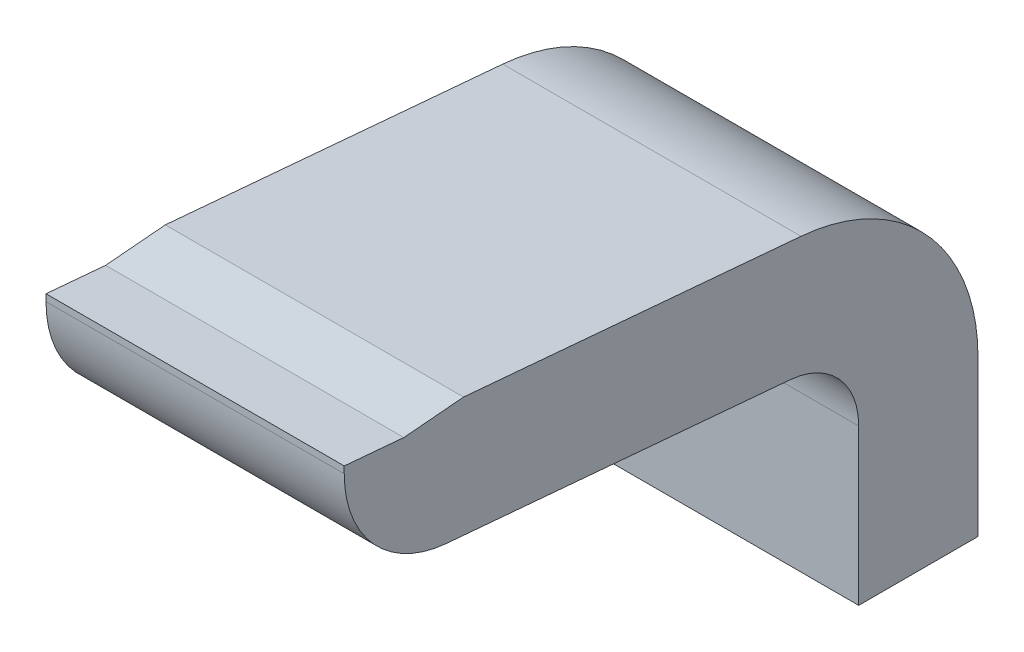
ISO-10303-21;
HEADER;
FILE_DESCRIPTION(('STEP AP214'),'2;1');
FILE_NAME('part.step','',(''),(''),'','','');
FILE_SCHEMA(('AUTOMOTIVE_DESIGN { 1 0 10303 214 1 1 1 1 }'));
ENDSEC;
DATA;
#1=APPLICATION_CONTEXT('core data for automotive mechanical design processes');
#2=APPLICATION_PROTOCOL_DEFINITION('international standard','automotive_design',2000,#1);
#3=PRODUCT_CONTEXT('',#1,'mechanical');
#4=PRODUCT('Part','Part','',(#3));
#5=PRODUCT_RELATED_PRODUCT_CATEGORY('part','',(#4));
#6=PRODUCT_DEFINITION_FORMATION('','',#4);
#7=PRODUCT_DEFINITION_CONTEXT('part definition',#1,'design');
#8=PRODUCT_DEFINITION('design','',#6,#7);
#9=PRODUCT_DEFINITION_SHAPE('','',#8);
#10=(LENGTH_UNIT() NAMED_UNIT(*) SI_UNIT(.MILLI.,.METRE.));
#11=(NAMED_UNIT(*) PLANE_ANGLE_UNIT() SI_UNIT($,.RADIAN.));
#12=(NAMED_UNIT(*) SI_UNIT($,.STERADIAN.) SOLID_ANGLE_UNIT());
#13=UNCERTAINTY_MEASURE_WITH_UNIT(LENGTH_MEASURE(1.E-05),#10,'distance_accuracy_value','');
#14=(GEOMETRIC_REPRESENTATION_CONTEXT(3) GLOBAL_UNCERTAINTY_ASSIGNED_CONTEXT((#13)) GLOBAL_UNIT_ASSIGNED_CONTEXT((#10,
#11,#12)) REPRESENTATION_CONTEXT('',''));
#15=CARTESIAN_POINT('',(0.,0.,0.));
#16=DIRECTION('',(0.,0.,1.));
#17=DIRECTION('',(1.,0.,0.));
#18=AXIS2_PLACEMENT_3D('',#15,#16,#17);
#19=CARTESIAN_POINT('',(-1.15,-1.25,0.16));
#20=DIRECTION('',(0.,-1.,0.));
#21=DIRECTION('',(0.,0.,-1.));
#22=AXIS2_PLACEMENT_3D('',#19,#20,#21);
#23=PLANE('',#22);
#24=DIRECTION('',(0.,0.,1.));
#25=VECTOR('',#24,1.);
#26=CARTESIAN_POINT('',(-1.15,-1.25,0.26));
#27=LINE('',#26,#25);
#28=CARTESIAN_POINT('',(-1.15,-1.25,0.));
#29=VERTEX_POINT('',#28);
#30=CARTESIAN_POINT('',(-1.15,-1.25,0.16));
#31=VERTEX_POINT('',#30);
#32=EDGE_CURVE('E118',#29,#31,#27,.T.);
#33=ORIENTED_EDGE('',*,*,#32,.F.);
#34=DIRECTION('',(1.,0.,0.));
#35=VECTOR('',#34,1.);
#36=CARTESIAN_POINT('',(-1.15,-1.25,0.));
#37=LINE('',#36,#35);
#38=CARTESIAN_POINT('',(-0.75,-1.25,0.));
#39=VERTEX_POINT('',#38);
#40=EDGE_CURVE('E181',#39,#29,#37,.F.);
#41=ORIENTED_EDGE('',*,*,#40,.F.);
#42=DIRECTION('',(0.,0.,1.));
#43=VECTOR('',#42,1.);
#44=CARTESIAN_POINT('',(-0.75,-1.25,0.26));
#45=LINE('',#44,#43);
#46=CARTESIAN_POINT('',(-0.75,-1.25,0.16));
#47=VERTEX_POINT('',#46);
#48=EDGE_CURVE('E137',#39,#47,#45,.T.);
#49=ORIENTED_EDGE('',*,*,#48,.T.);
#50=DIRECTION('',(1.,0.,0.));
#51=VECTOR('',#50,1.);
#52=CARTESIAN_POINT('',(-1.15,-1.25,0.16));
#53=LINE('',#52,#51);
#54=EDGE_CURVE('E168',#47,#31,#53,.F.);
#55=ORIENTED_EDGE('',*,*,#54,.T.);
#56=EDGE_LOOP('',(#33,#41,#49,#55));
#57=FACE_BOUND('',#56,.T.);
#58=ADVANCED_FACE('F17',(#57),#23,.T.);
#59=CARTESIAN_POINT('',(-1.15,-0.743000906918,0.85));
#60=DIRECTION('',(0.,0.,1.));
#61=DIRECTION('',(0.,-1.,0.));
#62=AXIS2_PLACEMENT_3D('',#59,#60,#61);
#63=PLANE('',#62);
#64=DIRECTION('',(0.,1.,0.));
#65=VECTOR('',#64,1.);
#66=CARTESIAN_POINT('',(-1.15,-1.041614189995,0.85));
#67=LINE('',#66,#65);
#68=CARTESIAN_POINT('',(-1.15,-0.752164218658,0.85));
#69=VERTEX_POINT('',#68);
#70=CARTESIAN_POINT('',(-1.15,-0.743000906918,0.85));
#71=VERTEX_POINT('',#70);
#72=EDGE_CURVE('E133',#69,#71,#67,.T.);
#73=ORIENTED_EDGE('',*,*,#72,.F.);
#74=DIRECTION('',(1.,0.,0.));
#75=VECTOR('',#74,1.);
#76=CARTESIAN_POINT('',(-1.15,-0.752164218658,0.85));
#77=LINE('',#76,#75);
#78=CARTESIAN_POINT('',(-0.75,-0.752164218658,0.85));
#79=VERTEX_POINT('',#78);
#80=EDGE_CURVE('E136',#79,#69,#77,.F.);
#81=ORIENTED_EDGE('',*,*,#80,.F.);
#82=DIRECTION('',(0.,1.,0.));
#83=VECTOR('',#82,1.);
#84=CARTESIAN_POINT('',(-0.75,-1.041614189995,0.85));
#85=LINE('',#84,#83);
#86=CARTESIAN_POINT('',(-0.75,-0.743000906918,0.85));
#87=VERTEX_POINT('',#86);
#88=EDGE_CURVE('E160',#79,#87,#85,.T.);
#89=ORIENTED_EDGE('',*,*,#88,.T.);
#90=DIRECTION('',(1.,0.,0.));
#91=VECTOR('',#90,1.);
#92=CARTESIAN_POINT('',(-1.15,-0.743000906918,0.85));
#93=LINE('',#92,#91);
#94=EDGE_CURVE('E203',#87,#71,#93,.F.);
#95=ORIENTED_EDGE('',*,*,#94,.T.);
#96=EDGE_LOOP('',(#73,#81,#89,#95));
#97=FACE_BOUND('',#96,.T.);
#98=ADVANCED_FACE('F249',(#97),#63,.T.);
#99=CARTESIAN_POINT('',(-1.15,-0.743000906918,0.85));
#100=DIRECTION('',(0.,-0.996194698091747,0.0871557427476379));
#101=DIRECTION('',(0.,-0.0871557427476379,-0.996194698091747));
#102=AXIS2_PLACEMENT_3D('',#99,#100,#101);
#103=PLANE('',#102);
#104=DIRECTION('',(1.,0.,0.));
#105=VECTOR('',#104,1.);
#106=CARTESIAN_POINT('',(-1.15,-0.75,0.77));
#107=LINE('',#106,#105);
#108=CARTESIAN_POINT('',(-0.75,-0.75,0.77));
#109=VERTEX_POINT('',#108);
#110=CARTESIAN_POINT('',(-1.15,-0.75,0.77));
#111=VERTEX_POINT('',#110);
#112=EDGE_CURVE('E193',#109,#111,#107,.F.);
#113=ORIENTED_EDGE('',*,*,#112,.T.);
#114=DIRECTION('',(0.,-0.0871557427467441,-0.996194698091825));
#115=VECTOR('',#114,1.);
#116=CARTESIAN_POINT('',(-1.15,-0.743000906918,0.85));
#117=LINE('',#116,#115);
#118=EDGE_CURVE('E199',#71,#111,#117,.T.);
#119=ORIENTED_EDGE('',*,*,#118,.F.);
#120=ORIENTED_EDGE('',*,*,#94,.F.);
#121=DIRECTION('',(0.,-0.0871557427467441,-0.996194698091825));
#122=VECTOR('',#121,1.);
#123=CARTESIAN_POINT('',(-0.75,-0.743000906918,0.85));
#124=LINE('',#123,#122);
#125=EDGE_CURVE('E157',#87,#109,#124,.T.);
#126=ORIENTED_EDGE('',*,*,#125,.T.);
#127=EDGE_LOOP('',(#113,#119,#120,#126));
#128=FACE_BOUND('',#127,.T.);
#129=ADVANCED_FACE('F251',(#128),#103,.F.);
#130=CARTESIAN_POINT('',(-1.15,-0.75,0.77));
#131=DIRECTION('',(0.,-0.996194698091747,-0.0871557427476379));
#132=DIRECTION('',(0.,0.0871557427476379,-0.996194698091747));
#133=AXIS2_PLACEMENT_3D('',#130,#131,#132);
#134=PLANE('',#133);
#135=DIRECTION('',(1.,0.,0.));
#136=VECTOR('',#135,1.);
#137=CARTESIAN_POINT('',(-1.15,-0.743000906917484,0.689999999999955));
#138=LINE('',#137,#136);
#139=CARTESIAN_POINT('',(-1.15,-0.743000906917828,0.689999999999984));
#140=VERTEX_POINT('',#139);
#141=CARTESIAN_POINT('',(-0.75,-0.743000906917827,0.68999999999997));
#142=VERTEX_POINT('',#141);
#143=EDGE_CURVE('E191',#140,#142,#138,.T.);
#144=ORIENTED_EDGE('',*,*,#143,.F.);
#145=DIRECTION('',(0.,0.0871557427467439,-0.996194698091825));
#146=VECTOR('',#145,1.);
#147=CARTESIAN_POINT('',(-1.15,-0.75,0.77));
#148=LINE('',#147,#146);
#149=EDGE_CURVE('E196',#111,#140,#148,.T.);
#150=ORIENTED_EDGE('',*,*,#149,.F.);
#151=ORIENTED_EDGE('',*,*,#112,.F.);
#152=DIRECTION('',(0.,0.0871557427467439,-0.996194698091825));
#153=VECTOR('',#152,1.);
#154=CARTESIAN_POINT('',(-0.75,-0.75,0.77));
#155=LINE('',#154,#153);
#156=EDGE_CURVE('E80',#109,#142,#155,.T.);
#157=ORIENTED_EDGE('',*,*,#156,.T.);
#158=EDGE_LOOP('',(#144,#150,#151,#157));
#159=FACE_BOUND('',#158,.T.);
#160=ADVANCED_FACE('F254',(#159),#134,.F.);
#161=CARTESIAN_POINT('',(-1.15,-0.782603568491,0.237339506886));
#162=DIRECTION('',(0.,0.996194698091747,-0.0871557427476379));
#163=DIRECTION('',(0.,0.0871557427476379,0.996194698091747));
#164=AXIS2_PLACEMENT_3D('',#161,#162,#163);
#165=PLANE('',#164);
#166=DIRECTION('',(0.,-0.0871557427465014,-0.996194698091847));
#167=VECTOR('',#166,1.);
#168=CARTESIAN_POINT('',(-1.15,-0.743000906918,0.69));
#169=LINE('',#168,#167);
#170=CARTESIAN_POINT('',(-1.15,-0.78260356849106,0.237339506885955));
#171=VERTEX_POINT('',#170);
#172=EDGE_CURVE('E131',#140,#171,#169,.T.);
#173=ORIENTED_EDGE('',*,*,#172,.F.);
#174=ORIENTED_EDGE('',*,*,#143,.T.);
#175=DIRECTION('',(0.,-0.0871557427465014,-0.996194698091847));
#176=VECTOR('',#175,1.);
#177=CARTESIAN_POINT('',(-0.75,-0.743000906918,0.69));
#178=LINE('',#177,#176);
#179=CARTESIAN_POINT('',(-0.75,-0.78260356849106,0.237339506885955));
#180=VERTEX_POINT('',#179);
#181=EDGE_CURVE('E70',#142,#180,#178,.T.);
#182=ORIENTED_EDGE('',*,*,#181,.T.);
#183=DIRECTION('',(1.,0.,0.));
#184=VECTOR('',#183,1.);
#185=CARTESIAN_POINT('',(-1.15,-0.782603568491111,0.23733950688601));
#186=LINE('',#185,#184);
#187=EDGE_CURVE('E184',#171,#180,#186,.T.);
#188=ORIENTED_EDGE('',*,*,#187,.F.);
#189=EDGE_LOOP('',(#173,#174,#182,#188));
#190=FACE_BOUND('',#189,.T.);
#191=ADVANCED_FACE('F255',(#190),#165,.T.);
#192=CARTESIAN_POINT('',(-1.15,-1.041614189995,0.26));
#193=DIRECTION('',(1.,0.,0.));
#194=DIRECTION('',(0.,0.,-1.));
#195=AXIS2_PLACEMENT_3D('',#192,#193,#194);
#196=CYLINDRICAL_SURFACE('',#195,0.26);
#197=CARTESIAN_POINT('',(-1.15,-1.041614189995,0.26));
#198=DIRECTION('',(1.,0.,0.));
#199=DIRECTION('',(0.,0.,-1.));
#200=AXIS2_PLACEMENT_3D('',#197,#198,#199);
#201=CIRCLE('',#200,0.26);
#202=CARTESIAN_POINT('',(-1.15,-1.041614189995,0.));
#203=VERTEX_POINT('',#202);
#204=EDGE_CURVE('E129',#171,#203,#201,.F.);
#205=ORIENTED_EDGE('',*,*,#204,.F.);
#206=ORIENTED_EDGE('',*,*,#187,.T.);
#207=CARTESIAN_POINT('',(-0.75,-1.041614189995,0.26));
#208=DIRECTION('',(1.,0.,0.));
#209=DIRECTION('',(0.,0.,-1.));
#210=AXIS2_PLACEMENT_3D('',#207,#208,#209);
#211=CIRCLE('',#210,0.26);
#212=CARTESIAN_POINT('',(-0.75,-1.041614189995,0.));
#213=VERTEX_POINT('',#212);
#214=EDGE_CURVE('E20',#180,#213,#211,.F.);
#215=ORIENTED_EDGE('',*,*,#214,.T.);
#216=DIRECTION('',(1.,0.,0.));
#217=VECTOR('',#216,1.);
#218=CARTESIAN_POINT('',(-1.15,-1.041614189995,0.));
#219=LINE('',#218,#217);
#220=EDGE_CURVE('E178',#203,#213,#219,.T.);
#221=ORIENTED_EDGE('',*,*,#220,.F.);
#222=EDGE_LOOP('',(#205,#206,#215,#221));
#223=FACE_BOUND('',#222,.T.);
#224=ADVANCED_FACE('F242',(#223),#196,.T.);
#225=CARTESIAN_POINT('',(-1.15,-1.25,0.));
#226=DIRECTION('',(0.,0.,-1.));
#227=DIRECTION('',(0.,1.,0.));
#228=AXIS2_PLACEMENT_3D('',#225,#226,#227);
#229=PLANE('',#228);
#230=DIRECTION('',(0.,1.,0.));
#231=VECTOR('',#230,1.);
#232=CARTESIAN_POINT('',(-1.15,-1.041614189995,0.));
#233=LINE('',#232,#231);
#234=EDGE_CURVE('E112',#203,#29,#233,.F.);
#235=ORIENTED_EDGE('',*,*,#234,.F.);
#236=ORIENTED_EDGE('',*,*,#220,.T.);
#237=DIRECTION('',(0.,1.,0.));
#238=VECTOR('',#237,1.);
#239=CARTESIAN_POINT('',(-0.75,-1.041614189995,0.));
#240=LINE('',#239,#238);
#241=EDGE_CURVE('E142',#213,#39,#240,.F.);
#242=ORIENTED_EDGE('',*,*,#241,.T.);
#243=ORIENTED_EDGE('',*,*,#40,.T.);
#244=EDGE_LOOP('',(#235,#236,#242,#243));
#245=FACE_BOUND('',#244,.T.);
#246=ADVANCED_FACE('F216',(#245),#229,.T.);
#247=CARTESIAN_POINT('',(-1.15,-1.25,0.16));
#248=DIRECTION('',(0.,0.,-1.));
#249=DIRECTION('',(0.,1.,0.));
#250=AXIS2_PLACEMENT_3D('',#247,#248,#249);
#251=PLANE('',#250);
#252=DIRECTION('',(1.,0.,0.));
#253=VECTOR('',#252,1.);
#254=CARTESIAN_POINT('',(-1.15,-1.041614189995,0.16));
#255=LINE('',#254,#253);
#256=CARTESIAN_POINT('',(-0.75,-1.041614189995,0.16));
#257=VERTEX_POINT('',#256);
#258=CARTESIAN_POINT('',(-1.15,-1.041614189995,0.16));
#259=VERTEX_POINT('',#258);
#260=EDGE_CURVE('E106',#257,#259,#255,.F.);
#261=ORIENTED_EDGE('',*,*,#260,.T.);
#262=DIRECTION('',(0.,1.,0.));
#263=VECTOR('',#262,1.);
#264=CARTESIAN_POINT('',(-1.15,-1.041614189995,0.16));
#265=LINE('',#264,#263);
#266=EDGE_CURVE('E108',#31,#259,#265,.T.);
#267=ORIENTED_EDGE('',*,*,#266,.F.);
#268=ORIENTED_EDGE('',*,*,#54,.F.);
#269=DIRECTION('',(0.,1.,0.));
#270=VECTOR('',#269,1.);
#271=CARTESIAN_POINT('',(-0.75,-1.041614189995,0.16));
#272=LINE('',#271,#270);
#273=EDGE_CURVE('E102',#47,#257,#272,.T.);
#274=ORIENTED_EDGE('',*,*,#273,.T.);
#275=EDGE_LOOP('',(#261,#267,#268,#274));
#276=FACE_BOUND('',#275,.T.);
#277=ADVANCED_FACE('F107',(#276),#251,.F.);
#278=CARTESIAN_POINT('',(-0.75,-1.041614189995,0.26));
#279=DIRECTION('',(-1.,0.,0.));
#280=DIRECTION('',(0.,0.,1.));
#281=AXIS2_PLACEMENT_3D('',#278,#279,#280);
#282=PLANE('',#281);
#283=ORIENTED_EDGE('',*,*,#241,.F.);
#284=ORIENTED_EDGE('',*,*,#214,.F.);
#285=ORIENTED_EDGE('',*,*,#181,.F.);
#286=ORIENTED_EDGE('',*,*,#156,.F.);
#287=ORIENTED_EDGE('',*,*,#125,.F.);
#288=ORIENTED_EDGE('',*,*,#88,.F.);
#289=CARTESIAN_POINT('',(-0.75,-0.752164218658,0.7));
#290=DIRECTION('',(1.,0.,0.));
#291=DIRECTION('',(0.,0.,-1.));
#292=AXIS2_PLACEMENT_3D('',#289,#290,#291);
#293=CIRCLE('',#292,0.15);
#294=CARTESIAN_POINT('',(-0.75,-0.901593423371993,0.713073361412083));
#295=VERTEX_POINT('',#294);
#296=EDGE_CURVE('E134',#295,#79,#293,.F.);
#297=ORIENTED_EDGE('',*,*,#296,.F.);
#298=DIRECTION('',(0.,-0.0871557427476379,-0.996194698091747));
#299=VECTOR('',#298,1.);
#300=CARTESIAN_POINT('',(-0.75,-0.901593423372,0.713073361412));
#301=LINE('',#300,#299);
#302=CARTESIAN_POINT('',(-0.75,-0.941994720186292,0.251284425725151));
#303=VERTEX_POINT('',#302);
#304=EDGE_CURVE('E125',#303,#295,#301,.F.);
#305=ORIENTED_EDGE('',*,*,#304,.F.);
#306=CARTESIAN_POINT('',(-0.75,-1.041614189995,0.26));
#307=DIRECTION('',(1.,0.,0.));
#308=DIRECTION('',(0.,0.,-1.));
#309=AXIS2_PLACEMENT_3D('',#306,#307,#308);
#310=CIRCLE('',#309,0.1);
#311=EDGE_CURVE('E123',#303,#257,#310,.F.);
#312=ORIENTED_EDGE('',*,*,#311,.T.);
#313=ORIENTED_EDGE('',*,*,#273,.F.);
#314=ORIENTED_EDGE('',*,*,#48,.F.);
#315=EDGE_LOOP('',(#283,#284,#285,#286,#287,#288,#297,#305,#312,#313,#314));
#316=FACE_BOUND('',#315,.T.);
#317=ADVANCED_FACE('F244',(#316),#282,.F.);
#318=CARTESIAN_POINT('',(-1.15,-0.752164218658,0.7));
#319=DIRECTION('',(1.,0.,0.));
#320=DIRECTION('',(0.,0.,-1.));
#321=AXIS2_PLACEMENT_3D('',#318,#319,#320);
#322=CYLINDRICAL_SURFACE('',#321,0.15);
#323=CARTESIAN_POINT('',(-1.15,-0.752164218658,0.7));
#324=DIRECTION('',(1.,0.,0.));
#325=DIRECTION('',(0.,0.,-1.));
#326=AXIS2_PLACEMENT_3D('',#323,#324,#325);
#327=CIRCLE('',#326,0.15);
#328=CARTESIAN_POINT('',(-1.15,-0.901593423371993,0.713073361412083));
#329=VERTEX_POINT('',#328);
#330=EDGE_CURVE('E119',#329,#69,#327,.F.);
#331=ORIENTED_EDGE('',*,*,#330,.F.);
#332=DIRECTION('',(1.,0.,0.));
#333=VECTOR('',#332,1.);
#334=CARTESIAN_POINT('',(-1.15,-0.901593423372,0.713073361412));
#335=LINE('',#334,#333);
#336=EDGE_CURVE('E233',#295,#329,#335,.F.);
#337=ORIENTED_EDGE('',*,*,#336,.F.);
#338=ORIENTED_EDGE('',*,*,#296,.T.);
#339=ORIENTED_EDGE('',*,*,#80,.T.);
#340=EDGE_LOOP('',(#331,#337,#338,#339));
#341=FACE_BOUND('',#340,.T.);
#342=ADVANCED_FACE('F248',(#341),#322,.T.);
#343=CARTESIAN_POINT('',(-1.15,-1.041614189995,0.26));
#344=DIRECTION('',(-1.,0.,0.));
#345=DIRECTION('',(0.,0.,1.));
#346=AXIS2_PLACEMENT_3D('',#343,#344,#345);
#347=PLANE('',#346);
#348=ORIENTED_EDGE('',*,*,#204,.T.);
#349=ORIENTED_EDGE('',*,*,#234,.T.);
#350=ORIENTED_EDGE('',*,*,#32,.T.);
#351=ORIENTED_EDGE('',*,*,#266,.T.);
#352=CARTESIAN_POINT('',(-1.15,-1.041614189995,0.26));
#353=DIRECTION('',(1.,0.,0.));
#354=DIRECTION('',(0.,0.,-1.));
#355=AXIS2_PLACEMENT_3D('',#352,#353,#354);
#356=CIRCLE('',#355,0.1);
#357=CARTESIAN_POINT('',(-1.15,-0.941994720186292,0.251284425725151));
#358=VERTEX_POINT('',#357);
#359=EDGE_CURVE('E35',#259,#358,#356,.T.);
#360=ORIENTED_EDGE('',*,*,#359,.T.);
#361=DIRECTION('',(0.,-0.0871557427476379,-0.996194698091747));
#362=VECTOR('',#361,1.);
#363=CARTESIAN_POINT('',(-1.15,-0.901593423372,0.713073361412));
#364=LINE('',#363,#362);
#365=EDGE_CURVE('E26',#329,#358,#364,.T.);
#366=ORIENTED_EDGE('',*,*,#365,.F.);
#367=ORIENTED_EDGE('',*,*,#330,.T.);
#368=ORIENTED_EDGE('',*,*,#72,.T.);
#369=ORIENTED_EDGE('',*,*,#118,.T.);
#370=ORIENTED_EDGE('',*,*,#149,.T.);
#371=ORIENTED_EDGE('',*,*,#172,.T.);
#372=EDGE_LOOP('',(#348,#349,#350,#351,#360,#366,#367,#368,#369,#370,#371));
#373=FACE_BOUND('',#372,.T.);
#374=ADVANCED_FACE('F115',(#373),#347,.T.);
#375=CARTESIAN_POINT('',(-1.15,-1.041614189995,0.26));
#376=DIRECTION('',(1.,0.,0.));
#377=DIRECTION('',(0.,0.,-1.));
#378=AXIS2_PLACEMENT_3D('',#375,#376,#377);
#379=CYLINDRICAL_SURFACE('',#378,0.1);
#380=DIRECTION('',(1.,0.,0.));
#381=VECTOR('',#380,1.);
#382=CARTESIAN_POINT('',(-1.15,-0.941994720186303,0.251284425725027));
#383=LINE('',#382,#381);
#384=EDGE_CURVE('E11',#358,#303,#383,.T.);
#385=ORIENTED_EDGE('',*,*,#384,.F.);
#386=ORIENTED_EDGE('',*,*,#359,.F.);
#387=ORIENTED_EDGE('',*,*,#260,.F.);
#388=ORIENTED_EDGE('',*,*,#311,.F.);
#389=EDGE_LOOP('',(#385,#386,#387,#388));
#390=FACE_BOUND('',#389,.T.);
#391=ADVANCED_FACE('F121',(#390),#379,.F.);
#392=CARTESIAN_POINT('',(-1.15,-0.901593423372,0.713073361412));
#393=DIRECTION('',(0.,-0.996194698091747,0.0871557427476379));
#394=DIRECTION('',(0.,-0.0871557427476379,-0.996194698091747));
#395=AXIS2_PLACEMENT_3D('',#392,#393,#394);
#396=PLANE('',#395);
#397=ORIENTED_EDGE('',*,*,#365,.T.);
#398=ORIENTED_EDGE('',*,*,#384,.T.);
#399=ORIENTED_EDGE('',*,*,#304,.T.);
#400=ORIENTED_EDGE('',*,*,#336,.T.);
#401=EDGE_LOOP('',(#397,#398,#399,#400));
#402=FACE_BOUND('',#401,.T.);
#403=ADVANCED_FACE('F246',(#402),#396,.T.);
#404=CLOSED_SHELL('',(#58,#98,#129,#160,#191,#224,#246,#277,#317,#342,#374,#391,#403));
#405=MANIFOLD_SOLID_BREP('B1',#404);
#406=ADVANCED_BREP_SHAPE_REPRESENTATION('',(#18,#405),#14);
#407=SHAPE_DEFINITION_REPRESENTATION(#9,#406);
ENDSEC;
END-ISO-10303-21;
